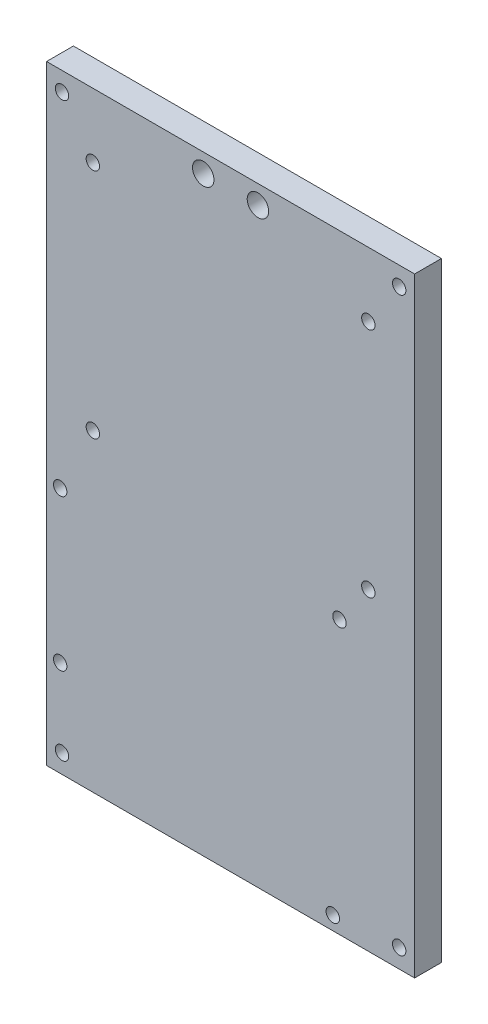
ISO-10303-21;
HEADER;
FILE_DESCRIPTION(('STEP AP214'),'2;1');
FILE_NAME('part.step','',(''),(''),'','','');
FILE_SCHEMA(('AUTOMOTIVE_DESIGN { 1 0 10303 214 1 1 1 1 }'));
ENDSEC;
DATA;
#1=APPLICATION_CONTEXT('core data for automotive mechanical design processes');
#2=APPLICATION_PROTOCOL_DEFINITION('international standard','automotive_design',2000,#1);
#3=PRODUCT_CONTEXT('',#1,'mechanical');
#4=PRODUCT('Part','Part','',(#3));
#5=PRODUCT_RELATED_PRODUCT_CATEGORY('part','',(#4));
#6=PRODUCT_DEFINITION_FORMATION('','',#4);
#7=PRODUCT_DEFINITION_CONTEXT('part definition',#1,'design');
#8=PRODUCT_DEFINITION('design','',#6,#7);
#9=PRODUCT_DEFINITION_SHAPE('','',#8);
#10=(LENGTH_UNIT() NAMED_UNIT(*) SI_UNIT(.MILLI.,.METRE.));
#11=(NAMED_UNIT(*) PLANE_ANGLE_UNIT() SI_UNIT($,.RADIAN.));
#12=(NAMED_UNIT(*) SI_UNIT($,.STERADIAN.) SOLID_ANGLE_UNIT());
#13=UNCERTAINTY_MEASURE_WITH_UNIT(LENGTH_MEASURE(1.E-05),#10,'distance_accuracy_value','');
#14=(GEOMETRIC_REPRESENTATION_CONTEXT(3) GLOBAL_UNCERTAINTY_ASSIGNED_CONTEXT((#13)) GLOBAL_UNIT_ASSIGNED_CONTEXT((#10,
#11,#12)) REPRESENTATION_CONTEXT('',''));
#15=CARTESIAN_POINT('',(0.,0.,0.));
#16=DIRECTION('',(0.,0.,1.));
#17=DIRECTION('',(1.,0.,0.));
#18=AXIS2_PLACEMENT_3D('',#15,#16,#17);
#19=CARTESIAN_POINT('',(0.,98.0600000011118,5.));
#20=DIRECTION('',(1.,0.,0.));
#21=DIRECTION('',(0.,1.,0.));
#22=AXIS2_PLACEMENT_3D('',#19,#20,#21);
#23=PLANE('',#22);
#24=DIRECTION('',(0.,-1.,0.));
#25=VECTOR('',#24,1.);
#26=CARTESIAN_POINT('',(0.,98.0600000011118,0.));
#27=LINE('',#26,#25);
#28=CARTESIAN_POINT('',(0.,98.0600000011118,0.));
#29=VERTEX_POINT('',#28);
#30=CARTESIAN_POINT('',(0.,-15.5899999988882,0.));
#31=VERTEX_POINT('',#30);
#32=EDGE_CURVE('E110',#29,#31,#27,.T.);
#33=ORIENTED_EDGE('',*,*,#32,.T.);
#34=DIRECTION('',(0.,0.,-1.));
#35=VECTOR('',#34,1.);
#36=CARTESIAN_POINT('',(0.,-15.5899999988882,5.));
#37=LINE('',#36,#35);
#38=CARTESIAN_POINT('',(0.,-15.5899999988882,5.));
#39=VERTEX_POINT('',#38);
#40=EDGE_CURVE('E11',#39,#31,#37,.T.);
#41=ORIENTED_EDGE('',*,*,#40,.F.);
#42=DIRECTION('',(0.,-1.,0.));
#43=VECTOR('',#42,1.);
#44=CARTESIAN_POINT('',(0.,98.0600000011118,5.));
#45=LINE('',#44,#43);
#46=CARTESIAN_POINT('',(0.,98.0600000011118,5.));
#47=VERTEX_POINT('',#46);
#48=EDGE_CURVE('E93',#47,#39,#45,.T.);
#49=ORIENTED_EDGE('',*,*,#48,.F.);
#50=DIRECTION('',(0.,0.,-1.));
#51=VECTOR('',#50,1.);
#52=CARTESIAN_POINT('',(0.,98.0600000011118,5.));
#53=LINE('',#52,#51);
#54=EDGE_CURVE('E106',#47,#29,#53,.T.);
#55=ORIENTED_EDGE('',*,*,#54,.T.);
#56=EDGE_LOOP('',(#33,#41,#49,#55));
#57=FACE_BOUND('',#56,.T.);
#58=ADVANCED_FACE('F39',(#57),#23,.F.);
#59=CARTESIAN_POINT('',(0.,-15.5899999988882,5.));
#60=DIRECTION('',(0.,1.,0.));
#61=DIRECTION('',(0.,0.,1.));
#62=AXIS2_PLACEMENT_3D('',#59,#60,#61);
#63=PLANE('',#62);
#64=DIRECTION('',(1.,0.,0.));
#65=VECTOR('',#64,1.);
#66=CARTESIAN_POINT('',(0.,-15.5899999988882,0.));
#67=LINE('',#66,#65);
#68=CARTESIAN_POINT('',(68.6000000011118,-15.5899999988882,0.));
#69=VERTEX_POINT('',#68);
#70=EDGE_CURVE('E98',#31,#69,#67,.T.);
#71=ORIENTED_EDGE('',*,*,#70,.T.);
#72=DIRECTION('',(0.,0.,-1.));
#73=VECTOR('',#72,1.);
#74=CARTESIAN_POINT('',(68.6000000011118,-15.5899999988882,5.));
#75=LINE('',#74,#73);
#76=CARTESIAN_POINT('',(68.6000000011118,-15.5899999988882,5.));
#77=VERTEX_POINT('',#76);
#78=EDGE_CURVE('E49',#77,#69,#75,.T.);
#79=ORIENTED_EDGE('',*,*,#78,.F.);
#80=DIRECTION('',(1.,0.,0.));
#81=VECTOR('',#80,1.);
#82=CARTESIAN_POINT('',(0.,-15.5899999988882,5.));
#83=LINE('',#82,#81);
#84=EDGE_CURVE('E88',#39,#77,#83,.T.);
#85=ORIENTED_EDGE('',*,*,#84,.F.);
#86=ORIENTED_EDGE('',*,*,#40,.T.);
#87=EDGE_LOOP('',(#71,#79,#85,#86));
#88=FACE_BOUND('',#87,.T.);
#89=ADVANCED_FACE('F97',(#88),#63,.F.);
#90=CARTESIAN_POINT('',(68.6000000011118,98.0600000011118,5.));
#91=DIRECTION('',(-1.,0.,0.));
#92=DIRECTION('',(0.,-1.,0.));
#93=AXIS2_PLACEMENT_3D('',#90,#91,#92);
#94=PLANE('',#93);
#95=DIRECTION('',(0.,1.,0.));
#96=VECTOR('',#95,1.);
#97=CARTESIAN_POINT('',(68.6000000011118,98.0600000011118,0.));
#98=LINE('',#97,#96);
#99=CARTESIAN_POINT('',(68.6000000011118,98.0600000011118,0.));
#100=VERTEX_POINT('',#99);
#101=EDGE_CURVE('E75',#69,#100,#98,.T.);
#102=ORIENTED_EDGE('',*,*,#101,.T.);
#103=DIRECTION('',(0.,0.,-1.));
#104=VECTOR('',#103,1.);
#105=CARTESIAN_POINT('',(68.6000000011118,98.0600000011118,5.));
#106=LINE('',#105,#104);
#107=CARTESIAN_POINT('',(68.6000000011118,98.0600000011118,5.));
#108=VERTEX_POINT('',#107);
#109=EDGE_CURVE('E100',#108,#100,#106,.T.);
#110=ORIENTED_EDGE('',*,*,#109,.F.);
#111=DIRECTION('',(0.,1.,0.));
#112=VECTOR('',#111,1.);
#113=CARTESIAN_POINT('',(68.6000000011118,98.0600000011118,5.));
#114=LINE('',#113,#112);
#115=EDGE_CURVE('E91',#77,#108,#114,.T.);
#116=ORIENTED_EDGE('',*,*,#115,.F.);
#117=ORIENTED_EDGE('',*,*,#78,.T.);
#118=EDGE_LOOP('',(#102,#110,#116,#117));
#119=FACE_BOUND('',#118,.T.);
#120=ADVANCED_FACE('F102',(#119),#94,.F.);
#121=CARTESIAN_POINT('',(0.,98.0600000011118,5.));
#122=DIRECTION('',(0.,-1.,0.));
#123=DIRECTION('',(0.,0.,-1.));
#124=AXIS2_PLACEMENT_3D('',#121,#122,#123);
#125=PLANE('',#124);
#126=DIRECTION('',(-1.,0.,0.));
#127=VECTOR('',#126,1.);
#128=CARTESIAN_POINT('',(0.,98.0600000011118,0.));
#129=LINE('',#128,#127);
#130=EDGE_CURVE('E81',#100,#29,#129,.T.);
#131=ORIENTED_EDGE('',*,*,#130,.T.);
#132=ORIENTED_EDGE('',*,*,#54,.F.);
#133=DIRECTION('',(-1.,0.,0.));
#134=VECTOR('',#133,1.);
#135=CARTESIAN_POINT('',(0.,98.0600000011118,5.));
#136=LINE('',#135,#134);
#137=EDGE_CURVE('E58',#108,#47,#136,.T.);
#138=ORIENTED_EDGE('',*,*,#137,.F.);
#139=ORIENTED_EDGE('',*,*,#109,.T.);
#140=EDGE_LOOP('',(#131,#132,#138,#139));
#141=FACE_BOUND('',#140,.T.);
#142=ADVANCED_FACE('F174',(#141),#125,.F.);
#143=CARTESIAN_POINT('',(0.,0.,5.));
#144=DIRECTION('',(0.,0.,1.));
#145=DIRECTION('',(1.,0.,0.));
#146=AXIS2_PLACEMENT_3D('',#143,#144,#145);
#147=PLANE('',#146);
#148=CARTESIAN_POINT('',(2.87500000055592,-12.0899999988882,5.));
#149=DIRECTION('',(0.,0.,1.));
#150=DIRECTION('',(1.,0.,0.));
#151=AXIS2_PLACEMENT_3D('',#148,#149,#150);
#152=CIRCLE('',#151,1.25);
#153=CARTESIAN_POINT('',(4.12500000055592,-12.0899999988882,5.));
#154=VERTEX_POINT('',#153);
#155=EDGE_CURVE('E355',#154,#154,#152,.F.);
#156=ORIENTED_EDGE('',*,*,#155,.T.);
#157=EDGE_LOOP('',(#156));
#158=FACE_BOUND('',#157,.T.);
#159=CARTESIAN_POINT('',(65.7250000005559,-12.0899999988882,5.));
#160=DIRECTION('',(0.,0.,1.));
#161=DIRECTION('',(1.,0.,0.));
#162=AXIS2_PLACEMENT_3D('',#159,#160,#161);
#163=CIRCLE('',#162,1.25);
#164=CARTESIAN_POINT('',(66.9750000005559,-12.0899999988882,5.));
#165=VERTEX_POINT('',#164);
#166=EDGE_CURVE('E380',#165,#165,#163,.F.);
#167=ORIENTED_EDGE('',*,*,#166,.T.);
#168=EDGE_LOOP('',(#167));
#169=FACE_BOUND('',#168,.T.);
#170=CARTESIAN_POINT('',(65.7250000005559,94.5600000011118,5.));
#171=DIRECTION('',(0.,0.,1.));
#172=DIRECTION('',(1.,0.,0.));
#173=AXIS2_PLACEMENT_3D('',#170,#171,#172);
#174=CIRCLE('',#173,1.25);
#175=CARTESIAN_POINT('',(66.9750000005559,94.5600000011118,5.));
#176=VERTEX_POINT('',#175);
#177=EDGE_CURVE('E376',#176,#176,#174,.F.);
#178=ORIENTED_EDGE('',*,*,#177,.T.);
#179=EDGE_LOOP('',(#178));
#180=FACE_BOUND('',#179,.T.);
#181=CARTESIAN_POINT('',(2.87500000055592,94.5600000011118,5.));
#182=DIRECTION('',(0.,0.,1.));
#183=DIRECTION('',(1.,0.,0.));
#184=AXIS2_PLACEMENT_3D('',#181,#182,#183);
#185=CIRCLE('',#184,1.25);
#186=CARTESIAN_POINT('',(4.12500000055592,94.5600000011118,5.));
#187=VERTEX_POINT('',#186);
#188=EDGE_CURVE('E372',#187,#187,#185,.F.);
#189=ORIENTED_EDGE('',*,*,#188,.T.);
#190=EDGE_LOOP('',(#189));
#191=FACE_BOUND('',#190,.T.);
#192=CARTESIAN_POINT('',(29.2025516455559,94.5600000011118,5.));
#193=DIRECTION('',(0.,0.,1.));
#194=DIRECTION('',(1.,0.,0.));
#195=AXIS2_PLACEMENT_3D('',#192,#193,#194);
#196=CIRCLE('',#195,2.00000000000001);
#197=CARTESIAN_POINT('',(31.2025516455559,94.5600000011118,5.));
#198=VERTEX_POINT('',#197);
#199=EDGE_CURVE('E398',#198,#198,#196,.F.);
#200=ORIENTED_EDGE('',*,*,#199,.T.);
#201=EDGE_LOOP('',(#200));
#202=FACE_BOUND('',#201,.T.);
#203=CARTESIAN_POINT('',(39.3974483555559,94.5600000011118,5.));
#204=DIRECTION('',(0.,0.,1.));
#205=DIRECTION('',(1.,0.,0.));
#206=AXIS2_PLACEMENT_3D('',#203,#204,#205);
#207=CIRCLE('',#206,2.);
#208=CARTESIAN_POINT('',(41.3974483555559,94.5600000011118,5.));
#209=VERTEX_POINT('',#208);
#210=EDGE_CURVE('E391',#209,#209,#207,.F.);
#211=ORIENTED_EDGE('',*,*,#210,.T.);
#212=EDGE_LOOP('',(#211));
#213=FACE_BOUND('',#212,.T.);
#214=CARTESIAN_POINT('',(59.9750000005559,86.0600000011118,5.));
#215=DIRECTION('',(0.,0.,1.));
#216=DIRECTION('',(1.,0.,0.));
#217=AXIS2_PLACEMENT_3D('',#214,#215,#216);
#218=CIRCLE('',#217,1.25);
#219=CARTESIAN_POINT('',(61.2250000005559,86.0600000011118,5.));
#220=VERTEX_POINT('',#219);
#221=EDGE_CURVE('E130',#220,#220,#218,.F.);
#222=ORIENTED_EDGE('',*,*,#221,.T.);
#223=EDGE_LOOP('',(#222));
#224=FACE_BOUND('',#223,.T.);
#225=CARTESIAN_POINT('',(8.62500000055592,42.8100000011118,5.));
#226=DIRECTION('',(0.,0.,1.));
#227=DIRECTION('',(1.,0.,0.));
#228=AXIS2_PLACEMENT_3D('',#225,#226,#227);
#229=CIRCLE('',#228,1.25);
#230=CARTESIAN_POINT('',(9.87500000055591,42.8100000011118,5.));
#231=VERTEX_POINT('',#230);
#232=EDGE_CURVE('E426',#231,#231,#229,.F.);
#233=ORIENTED_EDGE('',*,*,#232,.T.);
#234=EDGE_LOOP('',(#233));
#235=FACE_BOUND('',#234,.T.);
#236=CARTESIAN_POINT('',(59.9750000005559,42.8100000011118,5.));
#237=DIRECTION('',(0.,0.,1.));
#238=DIRECTION('',(1.,0.,0.));
#239=AXIS2_PLACEMENT_3D('',#236,#237,#238);
#240=CIRCLE('',#239,1.25);
#241=CARTESIAN_POINT('',(61.2250000005559,42.8100000011118,5.));
#242=VERTEX_POINT('',#241);
#243=EDGE_CURVE('E422',#242,#242,#240,.F.);
#244=ORIENTED_EDGE('',*,*,#243,.T.);
#245=EDGE_LOOP('',(#244));
#246=FACE_BOUND('',#245,.T.);
#247=CARTESIAN_POINT('',(8.62500000055592,86.0600000011118,5.));
#248=DIRECTION('',(0.,0.,1.));
#249=DIRECTION('',(1.,0.,0.));
#250=AXIS2_PLACEMENT_3D('',#247,#248,#249);
#251=CIRCLE('',#250,1.25);
#252=CARTESIAN_POINT('',(9.87500000055592,86.0600000011118,5.));
#253=VERTEX_POINT('',#252);
#254=EDGE_CURVE('E418',#253,#253,#251,.F.);
#255=ORIENTED_EDGE('',*,*,#254,.T.);
#256=EDGE_LOOP('',(#255));
#257=FACE_BOUND('',#256,.T.);
#258=CARTESIAN_POINT('',(53.3500000011118,-13.0499999988882,5.));
#259=DIRECTION('',(0.,0.,1.));
#260=DIRECTION('',(1.,0.,0.));
#261=AXIS2_PLACEMENT_3D('',#258,#259,#260);
#262=CIRCLE('',#261,1.25);
#263=CARTESIAN_POINT('',(54.6000000011118,-13.0499999988882,5.));
#264=VERTEX_POINT('',#263);
#265=EDGE_CURVE('E114',#264,#264,#262,.F.);
#266=ORIENTED_EDGE('',*,*,#265,.T.);
#267=EDGE_LOOP('',(#266));
#268=FACE_BOUND('',#267,.T.);
#269=CARTESIAN_POINT('',(54.6000000011118,35.2700000011118,5.));
#270=DIRECTION('',(0.,0.,1.));
#271=DIRECTION('',(1.,0.,0.));
#272=AXIS2_PLACEMENT_3D('',#269,#270,#271);
#273=CIRCLE('',#272,1.25);
#274=CARTESIAN_POINT('',(55.8500000011118,35.2700000011118,5.));
#275=VERTEX_POINT('',#274);
#276=EDGE_CURVE('E138',#275,#275,#273,.F.);
#277=ORIENTED_EDGE('',*,*,#276,.T.);
#278=EDGE_LOOP('',(#277));
#279=FACE_BOUND('',#278,.T.);
#280=CARTESIAN_POINT('',(2.54,30.4500000011118,5.));
#281=DIRECTION('',(0.,0.,1.));
#282=DIRECTION('',(1.,0.,0.));
#283=AXIS2_PLACEMENT_3D('',#280,#281,#282);
#284=CIRCLE('',#283,1.25);
#285=CARTESIAN_POINT('',(3.79,30.4500000011118,5.));
#286=VERTEX_POINT('',#285);
#287=EDGE_CURVE('E134',#286,#286,#284,.F.);
#288=ORIENTED_EDGE('',*,*,#287,.T.);
#289=EDGE_LOOP('',(#288));
#290=FACE_BOUND('',#289,.T.);
#291=CARTESIAN_POINT('',(2.54,2.28000000111181,5.));
#292=DIRECTION('',(0.,0.,1.));
#293=DIRECTION('',(1.,0.,0.));
#294=AXIS2_PLACEMENT_3D('',#291,#292,#293);
#295=CIRCLE('',#294,1.25);
#296=CARTESIAN_POINT('',(3.79,2.28000000111181,5.));
#297=VERTEX_POINT('',#296);
#298=EDGE_CURVE('E129',#297,#297,#295,.F.);
#299=ORIENTED_EDGE('',*,*,#298,.T.);
#300=EDGE_LOOP('',(#299));
#301=FACE_BOUND('',#300,.T.);
#302=ORIENTED_EDGE('',*,*,#48,.T.);
#303=ORIENTED_EDGE('',*,*,#84,.T.);
#304=ORIENTED_EDGE('',*,*,#115,.T.);
#305=ORIENTED_EDGE('',*,*,#137,.T.);
#306=EDGE_LOOP('',(#302,#303,#304,#305));
#307=FACE_BOUND('',#306,.T.);
#308=ADVANCED_FACE('F89',(#158,#169,#180,#191,#202,#213,#224,#235,#246,#257,#268,#279,#290,#301,
#307),#147,.T.);
#309=CARTESIAN_POINT('',(0.,0.,0.));
#310=DIRECTION('',(0.,0.,1.));
#311=DIRECTION('',(1.,0.,0.));
#312=AXIS2_PLACEMENT_3D('',#309,#310,#311);
#313=PLANE('',#312);
#314=CARTESIAN_POINT('',(2.87500000055592,-12.0899999988882,0.));
#315=DIRECTION('',(0.,0.,1.));
#316=DIRECTION('',(-1.,0.,0.));
#317=AXIS2_PLACEMENT_3D('',#314,#315,#316);
#318=CIRCLE('',#317,1.25);
#319=CARTESIAN_POINT('',(1.62500000055592,-12.0899999988882,0.));
#320=VERTEX_POINT('',#319);
#321=EDGE_CURVE('E358',#320,#320,#318,.T.);
#322=ORIENTED_EDGE('',*,*,#321,.T.);
#323=EDGE_LOOP('',(#322));
#324=FACE_BOUND('',#323,.T.);
#325=CARTESIAN_POINT('',(65.7250000005559,-12.0899999988882,0.));
#326=DIRECTION('',(0.,0.,1.));
#327=DIRECTION('',(1.,0.,0.));
#328=AXIS2_PLACEMENT_3D('',#325,#326,#327);
#329=CIRCLE('',#328,1.25);
#330=CARTESIAN_POINT('',(66.9750000005559,-12.0899999988882,0.));
#331=VERTEX_POINT('',#330);
#332=EDGE_CURVE('E360',#331,#331,#329,.T.);
#333=ORIENTED_EDGE('',*,*,#332,.T.);
#334=EDGE_LOOP('',(#333));
#335=FACE_BOUND('',#334,.T.);
#336=CARTESIAN_POINT('',(65.7250000005559,94.5600000011118,0.));
#337=DIRECTION('',(0.,0.,1.));
#338=DIRECTION('',(-1.,0.,0.));
#339=AXIS2_PLACEMENT_3D('',#336,#337,#338);
#340=CIRCLE('',#339,1.25);
#341=CARTESIAN_POINT('',(64.4750000005559,94.5600000011118,0.));
#342=VERTEX_POINT('',#341);
#343=EDGE_CURVE('E364',#342,#342,#340,.T.);
#344=ORIENTED_EDGE('',*,*,#343,.T.);
#345=EDGE_LOOP('',(#344));
#346=FACE_BOUND('',#345,.T.);
#347=CARTESIAN_POINT('',(2.87500000055592,94.5600000011118,0.));
#348=DIRECTION('',(0.,0.,1.));
#349=DIRECTION('',(1.,0.,0.));
#350=AXIS2_PLACEMENT_3D('',#347,#348,#349);
#351=CIRCLE('',#350,1.25);
#352=CARTESIAN_POINT('',(4.12500000055592,94.5600000011118,0.));
#353=VERTEX_POINT('',#352);
#354=EDGE_CURVE('E368',#353,#353,#351,.T.);
#355=ORIENTED_EDGE('',*,*,#354,.T.);
#356=EDGE_LOOP('',(#355));
#357=FACE_BOUND('',#356,.T.);
#358=CARTESIAN_POINT('',(29.2025516455559,94.5600000011118,0.));
#359=DIRECTION('',(0.,0.,1.));
#360=DIRECTION('',(1.,0.,0.));
#361=AXIS2_PLACEMENT_3D('',#358,#359,#360);
#362=CIRCLE('',#361,2.00000000000001);
#363=CARTESIAN_POINT('',(31.2025516455559,94.5600000011118,0.));
#364=VERTEX_POINT('',#363);
#365=EDGE_CURVE('E387',#364,#364,#362,.T.);
#366=ORIENTED_EDGE('',*,*,#365,.T.);
#367=EDGE_LOOP('',(#366));
#368=FACE_BOUND('',#367,.T.);
#369=CARTESIAN_POINT('',(39.3974483555559,94.5600000011118,0.));
#370=DIRECTION('',(0.,0.,1.));
#371=DIRECTION('',(-1.,0.,0.));
#372=AXIS2_PLACEMENT_3D('',#369,#370,#371);
#373=CIRCLE('',#372,2.);
#374=CARTESIAN_POINT('',(37.3974483555559,94.5600000011118,0.));
#375=VERTEX_POINT('',#374);
#376=EDGE_CURVE('E386',#375,#375,#373,.T.);
#377=ORIENTED_EDGE('',*,*,#376,.T.);
#378=EDGE_LOOP('',(#377));
#379=FACE_BOUND('',#378,.T.);
#380=CARTESIAN_POINT('',(59.9750000005559,86.0600000011118,0.));
#381=DIRECTION('',(0.,0.,1.));
#382=DIRECTION('',(-1.,0.,0.));
#383=AXIS2_PLACEMENT_3D('',#380,#381,#382);
#384=CIRCLE('',#383,1.25);
#385=CARTESIAN_POINT('',(58.7250000005559,86.0600000011118,0.));
#386=VERTEX_POINT('',#385);
#387=EDGE_CURVE('E407',#386,#386,#384,.T.);
#388=ORIENTED_EDGE('',*,*,#387,.T.);
#389=EDGE_LOOP('',(#388));
#390=FACE_BOUND('',#389,.T.);
#391=CARTESIAN_POINT('',(8.62500000055592,42.8100000011118,0.));
#392=DIRECTION('',(0.,0.,1.));
#393=DIRECTION('',(-1.,0.,0.));
#394=AXIS2_PLACEMENT_3D('',#391,#392,#393);
#395=CIRCLE('',#394,1.25);
#396=CARTESIAN_POINT('',(7.37500000055592,42.8100000011118,0.));
#397=VERTEX_POINT('',#396);
#398=EDGE_CURVE('E406',#397,#397,#395,.T.);
#399=ORIENTED_EDGE('',*,*,#398,.T.);
#400=EDGE_LOOP('',(#399));
#401=FACE_BOUND('',#400,.T.);
#402=CARTESIAN_POINT('',(59.9750000005559,42.8100000011118,0.));
#403=DIRECTION('',(0.,0.,1.));
#404=DIRECTION('',(1.,0.,0.));
#405=AXIS2_PLACEMENT_3D('',#402,#403,#404);
#406=CIRCLE('',#405,1.25);
#407=CARTESIAN_POINT('',(61.2250000005559,42.8100000011118,0.));
#408=VERTEX_POINT('',#407);
#409=EDGE_CURVE('E402',#408,#408,#406,.T.);
#410=ORIENTED_EDGE('',*,*,#409,.T.);
#411=EDGE_LOOP('',(#410));
#412=FACE_BOUND('',#411,.T.);
#413=CARTESIAN_POINT('',(8.62500000055592,86.0600000011118,0.));
#414=DIRECTION('',(0.,0.,1.));
#415=DIRECTION('',(1.,0.,0.));
#416=AXIS2_PLACEMENT_3D('',#413,#414,#415);
#417=CIRCLE('',#416,1.25);
#418=CARTESIAN_POINT('',(9.87500000055592,86.0600000011118,0.));
#419=VERTEX_POINT('',#418);
#420=EDGE_CURVE('E411',#419,#419,#417,.T.);
#421=ORIENTED_EDGE('',*,*,#420,.T.);
#422=EDGE_LOOP('',(#421));
#423=FACE_BOUND('',#422,.T.);
#424=CARTESIAN_POINT('',(53.3500000011118,-13.0499999988882,0.));
#425=DIRECTION('',(0.,0.,1.));
#426=DIRECTION('',(1.,0.,0.));
#427=AXIS2_PLACEMENT_3D('',#424,#425,#426);
#428=CIRCLE('',#427,1.25);
#429=CARTESIAN_POINT('',(54.6000000011118,-13.0499999988882,0.));
#430=VERTEX_POINT('',#429);
#431=EDGE_CURVE('E42',#430,#430,#428,.F.);
#432=ORIENTED_EDGE('',*,*,#431,.F.);
#433=EDGE_LOOP('',(#432));
#434=FACE_BOUND('',#433,.T.);
#435=CARTESIAN_POINT('',(54.6000000011118,35.2700000011118,0.));
#436=DIRECTION('',(0.,0.,1.));
#437=DIRECTION('',(1.,0.,0.));
#438=AXIS2_PLACEMENT_3D('',#435,#436,#437);
#439=CIRCLE('',#438,1.25);
#440=CARTESIAN_POINT('',(55.8500000011118,35.2700000011118,0.));
#441=VERTEX_POINT('',#440);
#442=EDGE_CURVE('E135',#441,#441,#439,.F.);
#443=ORIENTED_EDGE('',*,*,#442,.F.);
#444=EDGE_LOOP('',(#443));
#445=FACE_BOUND('',#444,.T.);
#446=CARTESIAN_POINT('',(2.54,30.4500000011118,0.));
#447=DIRECTION('',(0.,0.,1.));
#448=DIRECTION('',(1.,0.,0.));
#449=AXIS2_PLACEMENT_3D('',#446,#447,#448);
#450=CIRCLE('',#449,1.25);
#451=CARTESIAN_POINT('',(3.79,30.4500000011118,0.));
#452=VERTEX_POINT('',#451);
#453=EDGE_CURVE('E131',#452,#452,#450,.F.);
#454=ORIENTED_EDGE('',*,*,#453,.F.);
#455=EDGE_LOOP('',(#454));
#456=FACE_BOUND('',#455,.T.);
#457=CARTESIAN_POINT('',(2.54,2.28000000111181,0.));
#458=DIRECTION('',(0.,0.,1.));
#459=DIRECTION('',(1.,0.,0.));
#460=AXIS2_PLACEMENT_3D('',#457,#458,#459);
#461=CIRCLE('',#460,1.25);
#462=CARTESIAN_POINT('',(3.79,2.28000000111181,0.));
#463=VERTEX_POINT('',#462);
#464=EDGE_CURVE('E125',#463,#463,#461,.F.);
#465=ORIENTED_EDGE('',*,*,#464,.F.);
#466=EDGE_LOOP('',(#465));
#467=FACE_BOUND('',#466,.T.);
#468=ORIENTED_EDGE('',*,*,#32,.F.);
#469=ORIENTED_EDGE('',*,*,#130,.F.);
#470=ORIENTED_EDGE('',*,*,#101,.F.);
#471=ORIENTED_EDGE('',*,*,#70,.F.);
#472=EDGE_LOOP('',(#468,#469,#470,#471));
#473=FACE_BOUND('',#472,.T.);
#474=ADVANCED_FACE('F161',(#324,#335,#346,#357,#368,#379,#390,#401,#412,#423,#434,#445,#456,
#467,#473),#313,.F.);
#475=CARTESIAN_POINT('',(2.54,2.28000000111181,22.));
#476=DIRECTION('',(0.,0.,-1.));
#477=DIRECTION('',(-1.,0.,0.));
#478=AXIS2_PLACEMENT_3D('',#475,#476,#477);
#479=CYLINDRICAL_SURFACE('',#478,1.25);
#480=ORIENTED_EDGE('',*,*,#298,.F.);
#481=EDGE_LOOP('',(#480));
#482=FACE_BOUND('',#481,.T.);
#483=ORIENTED_EDGE('',*,*,#464,.T.);
#484=EDGE_LOOP('',(#483));
#485=FACE_BOUND('',#484,.T.);
#486=ADVANCED_FACE('F164',(#482,#485),#479,.F.);
#487=CARTESIAN_POINT('',(2.54,30.4500000011118,22.));
#488=DIRECTION('',(0.,0.,-1.));
#489=DIRECTION('',(-1.,0.,0.));
#490=AXIS2_PLACEMENT_3D('',#487,#488,#489);
#491=CYLINDRICAL_SURFACE('',#490,1.25);
#492=ORIENTED_EDGE('',*,*,#287,.F.);
#493=EDGE_LOOP('',(#492));
#494=FACE_BOUND('',#493,.T.);
#495=ORIENTED_EDGE('',*,*,#453,.T.);
#496=EDGE_LOOP('',(#495));
#497=FACE_BOUND('',#496,.T.);
#498=ADVANCED_FACE('F208',(#494,#497),#491,.F.);
#499=CARTESIAN_POINT('',(54.6000000011118,35.2700000011118,22.));
#500=DIRECTION('',(0.,0.,-1.));
#501=DIRECTION('',(-1.,0.,0.));
#502=AXIS2_PLACEMENT_3D('',#499,#500,#501);
#503=CYLINDRICAL_SURFACE('',#502,1.25);
#504=ORIENTED_EDGE('',*,*,#276,.F.);
#505=EDGE_LOOP('',(#504));
#506=FACE_BOUND('',#505,.T.);
#507=ORIENTED_EDGE('',*,*,#442,.T.);
#508=EDGE_LOOP('',(#507));
#509=FACE_BOUND('',#508,.T.);
#510=ADVANCED_FACE('F219',(#506,#509),#503,.F.);
#511=CARTESIAN_POINT('',(53.3500000011118,-13.0499999988882,22.));
#512=DIRECTION('',(0.,0.,-1.));
#513=DIRECTION('',(-1.,0.,0.));
#514=AXIS2_PLACEMENT_3D('',#511,#512,#513);
#515=CYLINDRICAL_SURFACE('',#514,1.25);
#516=ORIENTED_EDGE('',*,*,#265,.F.);
#517=EDGE_LOOP('',(#516));
#518=FACE_BOUND('',#517,.T.);
#519=ORIENTED_EDGE('',*,*,#431,.T.);
#520=EDGE_LOOP('',(#519));
#521=FACE_BOUND('',#520,.T.);
#522=ADVANCED_FACE('F159',(#518,#521),#515,.F.);
#523=CARTESIAN_POINT('',(8.62500000055592,86.0600000011118,20.));
#524=DIRECTION('',(0.,0.,-1.));
#525=DIRECTION('',(-1.,0.,0.));
#526=AXIS2_PLACEMENT_3D('',#523,#524,#525);
#527=CYLINDRICAL_SURFACE('',#526,1.25);
#528=ORIENTED_EDGE('',*,*,#254,.F.);
#529=EDGE_LOOP('',(#528));
#530=FACE_BOUND('',#529,.T.);
#531=ORIENTED_EDGE('',*,*,#420,.F.);
#532=EDGE_LOOP('',(#531));
#533=FACE_BOUND('',#532,.T.);
#534=ADVANCED_FACE('F238',(#530,#533),#527,.F.);
#535=CARTESIAN_POINT('',(59.9750000005559,42.8100000011118,20.));
#536=DIRECTION('',(0.,0.,-1.));
#537=DIRECTION('',(-1.,0.,0.));
#538=AXIS2_PLACEMENT_3D('',#535,#536,#537);
#539=CYLINDRICAL_SURFACE('',#538,1.25);
#540=ORIENTED_EDGE('',*,*,#243,.F.);
#541=EDGE_LOOP('',(#540));
#542=FACE_BOUND('',#541,.T.);
#543=ORIENTED_EDGE('',*,*,#409,.F.);
#544=EDGE_LOOP('',(#543));
#545=FACE_BOUND('',#544,.T.);
#546=ADVANCED_FACE('F248',(#542,#545),#539,.F.);
#547=CARTESIAN_POINT('',(8.62500000055592,42.8100000011118,20.));
#548=DIRECTION('',(0.,0.,-1.));
#549=DIRECTION('',(-1.,0.,0.));
#550=AXIS2_PLACEMENT_3D('',#547,#548,#549);
#551=CYLINDRICAL_SURFACE('',#550,1.25);
#552=ORIENTED_EDGE('',*,*,#232,.F.);
#553=EDGE_LOOP('',(#552));
#554=FACE_BOUND('',#553,.T.);
#555=ORIENTED_EDGE('',*,*,#398,.F.);
#556=EDGE_LOOP('',(#555));
#557=FACE_BOUND('',#556,.T.);
#558=ADVANCED_FACE('F258',(#554,#557),#551,.F.);
#559=CARTESIAN_POINT('',(59.9750000005559,86.0600000011118,20.));
#560=DIRECTION('',(0.,0.,-1.));
#561=DIRECTION('',(-1.,0.,0.));
#562=AXIS2_PLACEMENT_3D('',#559,#560,#561);
#563=CYLINDRICAL_SURFACE('',#562,1.25);
#564=ORIENTED_EDGE('',*,*,#221,.F.);
#565=EDGE_LOOP('',(#564));
#566=FACE_BOUND('',#565,.T.);
#567=ORIENTED_EDGE('',*,*,#387,.F.);
#568=EDGE_LOOP('',(#567));
#569=FACE_BOUND('',#568,.T.);
#570=ADVANCED_FACE('F268',(#566,#569),#563,.F.);
#571=CARTESIAN_POINT('',(39.3974483555559,94.5600000011118,13.));
#572=DIRECTION('',(0.,0.,-1.));
#573=DIRECTION('',(-1.,0.,0.));
#574=AXIS2_PLACEMENT_3D('',#571,#572,#573);
#575=CYLINDRICAL_SURFACE('',#574,2.);
#576=ORIENTED_EDGE('',*,*,#210,.F.);
#577=EDGE_LOOP('',(#576));
#578=FACE_BOUND('',#577,.T.);
#579=ORIENTED_EDGE('',*,*,#376,.F.);
#580=EDGE_LOOP('',(#579));
#581=FACE_BOUND('',#580,.T.);
#582=ADVANCED_FACE('F278',(#578,#581),#575,.F.);
#583=CARTESIAN_POINT('',(29.2025516455559,94.5600000011118,13.));
#584=DIRECTION('',(0.,0.,-1.));
#585=DIRECTION('',(-1.,0.,0.));
#586=AXIS2_PLACEMENT_3D('',#583,#584,#585);
#587=CYLINDRICAL_SURFACE('',#586,2.00000000000001);
#588=ORIENTED_EDGE('',*,*,#199,.F.);
#589=EDGE_LOOP('',(#588));
#590=FACE_BOUND('',#589,.T.);
#591=ORIENTED_EDGE('',*,*,#365,.F.);
#592=EDGE_LOOP('',(#591));
#593=FACE_BOUND('',#592,.T.);
#594=ADVANCED_FACE('F288',(#590,#593),#587,.F.);
#595=CARTESIAN_POINT('',(2.87500000055592,94.5600000011118,24.));
#596=DIRECTION('',(0.,0.,-1.));
#597=DIRECTION('',(-1.,0.,0.));
#598=AXIS2_PLACEMENT_3D('',#595,#596,#597);
#599=CYLINDRICAL_SURFACE('',#598,1.25);
#600=ORIENTED_EDGE('',*,*,#188,.F.);
#601=EDGE_LOOP('',(#600));
#602=FACE_BOUND('',#601,.T.);
#603=ORIENTED_EDGE('',*,*,#354,.F.);
#604=EDGE_LOOP('',(#603));
#605=FACE_BOUND('',#604,.T.);
#606=ADVANCED_FACE('F298',(#602,#605),#599,.F.);
#607=CARTESIAN_POINT('',(65.7250000005559,94.5600000011118,24.));
#608=DIRECTION('',(0.,0.,-1.));
#609=DIRECTION('',(-1.,0.,0.));
#610=AXIS2_PLACEMENT_3D('',#607,#608,#609);
#611=CYLINDRICAL_SURFACE('',#610,1.25);
#612=ORIENTED_EDGE('',*,*,#177,.F.);
#613=EDGE_LOOP('',(#612));
#614=FACE_BOUND('',#613,.T.);
#615=ORIENTED_EDGE('',*,*,#343,.F.);
#616=EDGE_LOOP('',(#615));
#617=FACE_BOUND('',#616,.T.);
#618=ADVANCED_FACE('F318',(#614,#617),#611,.F.);
#619=CARTESIAN_POINT('',(65.7250000005559,-12.0899999988882,24.));
#620=DIRECTION('',(0.,0.,-1.));
#621=DIRECTION('',(-1.,0.,0.));
#622=AXIS2_PLACEMENT_3D('',#619,#620,#621);
#623=CYLINDRICAL_SURFACE('',#622,1.25);
#624=ORIENTED_EDGE('',*,*,#166,.F.);
#625=EDGE_LOOP('',(#624));
#626=FACE_BOUND('',#625,.T.);
#627=ORIENTED_EDGE('',*,*,#332,.F.);
#628=EDGE_LOOP('',(#627));
#629=FACE_BOUND('',#628,.T.);
#630=ADVANCED_FACE('F328',(#626,#629),#623,.F.);
#631=CARTESIAN_POINT('',(2.87500000055592,-12.0899999988882,24.));
#632=DIRECTION('',(0.,0.,-1.));
#633=DIRECTION('',(-1.,0.,0.));
#634=AXIS2_PLACEMENT_3D('',#631,#632,#633);
#635=CYLINDRICAL_SURFACE('',#634,1.25);
#636=ORIENTED_EDGE('',*,*,#155,.F.);
#637=EDGE_LOOP('',(#636));
#638=FACE_BOUND('',#637,.T.);
#639=ORIENTED_EDGE('',*,*,#321,.F.);
#640=EDGE_LOOP('',(#639));
#641=FACE_BOUND('',#640,.T.);
#642=ADVANCED_FACE('F338',(#638,#641),#635,.F.);
#643=CLOSED_SHELL('',(#58,#89,#120,#142,#308,#474,#486,#498,#510,#522,#534,#546,#558,#570,#582,
#594,#606,#618,#630,#642));
#644=MANIFOLD_SOLID_BREP('B2',#643);
#645=ADVANCED_BREP_SHAPE_REPRESENTATION('',(#18,#644),#14);
#646=SHAPE_DEFINITION_REPRESENTATION(#9,#645);
ENDSEC;
END-ISO-10303-21;
